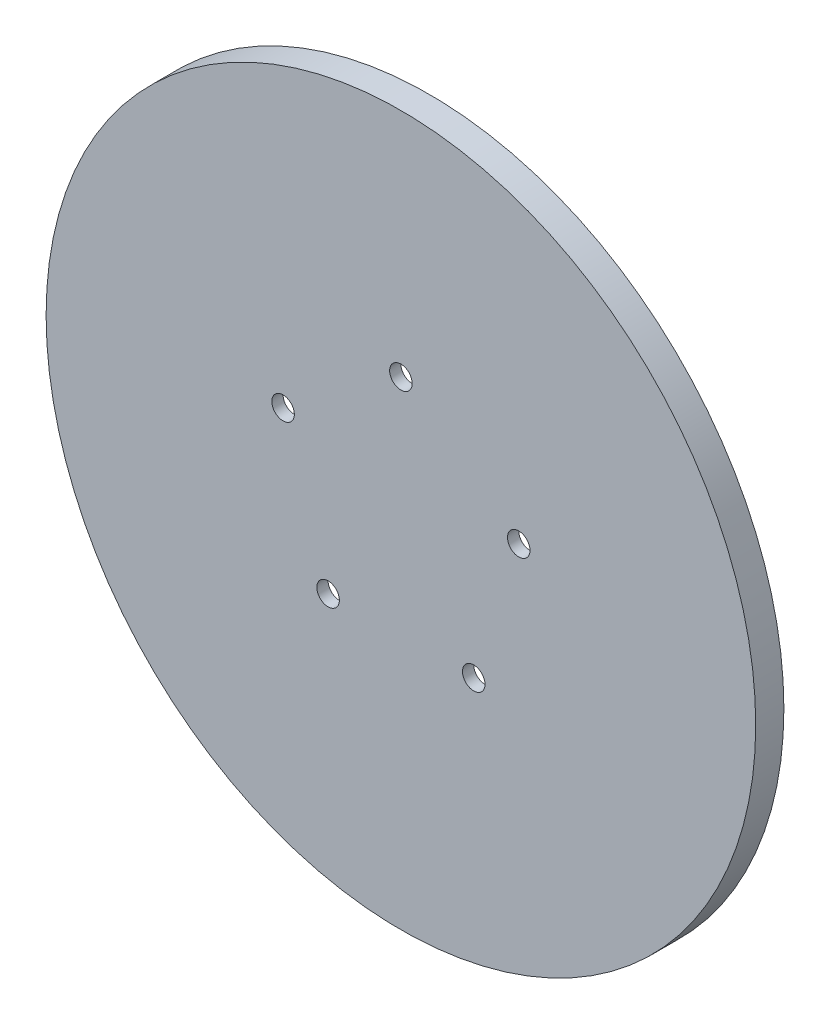
ISO-10303-21;
HEADER;
FILE_DESCRIPTION(('STEP AP214'),'2;1');
FILE_NAME('part.step','',(''),(''),'','','');
FILE_SCHEMA(('AUTOMOTIVE_DESIGN { 1 0 10303 214 1 1 1 1 }'));
ENDSEC;
DATA;
#1=APPLICATION_CONTEXT('core data for automotive mechanical design processes');
#2=APPLICATION_PROTOCOL_DEFINITION('international standard','automotive_design',2000,#1);
#3=PRODUCT_CONTEXT('',#1,'mechanical');
#4=PRODUCT('Part','Part','',(#3));
#5=PRODUCT_RELATED_PRODUCT_CATEGORY('part','',(#4));
#6=PRODUCT_DEFINITION_FORMATION('','',#4);
#7=PRODUCT_DEFINITION_CONTEXT('part definition',#1,'design');
#8=PRODUCT_DEFINITION('design','',#6,#7);
#9=PRODUCT_DEFINITION_SHAPE('','',#8);
#10=(LENGTH_UNIT() NAMED_UNIT(*) SI_UNIT(.MILLI.,.METRE.));
#11=(NAMED_UNIT(*) PLANE_ANGLE_UNIT() SI_UNIT($,.RADIAN.));
#12=(NAMED_UNIT(*) SI_UNIT($,.STERADIAN.) SOLID_ANGLE_UNIT());
#13=UNCERTAINTY_MEASURE_WITH_UNIT(LENGTH_MEASURE(1.E-05),#10,'distance_accuracy_value','');
#14=(GEOMETRIC_REPRESENTATION_CONTEXT(3) GLOBAL_UNCERTAINTY_ASSIGNED_CONTEXT((#13)) GLOBAL_UNIT_ASSIGNED_CONTEXT((#10,
#11,#12)) REPRESENTATION_CONTEXT('',''));
#15=CARTESIAN_POINT('',(0.,0.,0.));
#16=DIRECTION('',(0.,0.,1.));
#17=DIRECTION('',(1.,0.,0.));
#18=AXIS2_PLACEMENT_3D('',#15,#16,#17);
#19=CARTESIAN_POINT('',(0.,0.,33.2994));
#20=DIRECTION('',(0.,0.,-1.));
#21=DIRECTION('',(-1.,0.,0.));
#22=AXIS2_PLACEMENT_3D('',#19,#20,#21);
#23=CYLINDRICAL_SURFACE('',#22,75.4214507689291);
#24=DIRECTION('',(0.,0.,1.));
#25=VECTOR('',#24,1.);
#26=CARTESIAN_POINT('',(-38.3699227686586,64.9318432113026,29.4894));
#27=LINE('',#26,#25);
#28=CARTESIAN_POINT('',(-38.3699227686586,64.9318432113025,29.4894));
#29=VERTEX_POINT('',#28);
#30=CARTESIAN_POINT('',(-38.3699227686586,64.9318432113025,33.2994));
#31=VERTEX_POINT('',#30);
#32=EDGE_CURVE('E161',#29,#31,#27,.T.);
#33=ORIENTED_EDGE('',*,*,#32,.F.);
#34=CARTESIAN_POINT('',(0.,0.,29.4894));
#35=DIRECTION('',(0.,0.,1.));
#36=DIRECTION('',(1.,0.,0.));
#37=AXIS2_PLACEMENT_3D('',#34,#35,#36);
#38=CIRCLE('',#37,75.4214507689291);
#39=CARTESIAN_POINT('',(60.2975269398968,45.3056672064591,29.4894));
#40=VERTEX_POINT('',#39);
#41=EDGE_CURVE('E319',#40,#29,#38,.T.);
#42=ORIENTED_EDGE('',*,*,#41,.F.);
#43=DIRECTION('',(0.,0.,1.));
#44=VECTOR('',#43,1.);
#45=CARTESIAN_POINT('',(60.2975269398968,45.3056672064591,29.4894));
#46=LINE('',#45,#44);
#47=CARTESIAN_POINT('',(60.2975269398968,45.3056672064591,33.2994));
#48=VERTEX_POINT('',#47);
#49=EDGE_CURVE('E177',#40,#48,#46,.T.);
#50=ORIENTED_EDGE('',*,*,#49,.T.);
#51=CARTESIAN_POINT('',(0.,0.,33.2994));
#52=DIRECTION('',(0.,0.,1.));
#53=DIRECTION('',(1.,0.,0.));
#54=AXIS2_PLACEMENT_3D('',#51,#52,#53);
#55=CIRCLE('',#54,75.4214507689291);
#56=EDGE_CURVE('E175',#48,#31,#55,.T.);
#57=ORIENTED_EDGE('',*,*,#56,.T.);
#58=EDGE_LOOP('',(#33,#42,#50,#57));
#59=FACE_BOUND('',#58,.T.);
#60=ADVANCED_FACE('F47',(#59),#23,.F.);
#61=DIRECTION('',(0.,0.,1.));
#62=VECTOR('',#61,1.);
#63=CARTESIAN_POINT('',(64.9318432113027,38.3699227686583,29.4894));
#64=LINE('',#63,#62);
#65=CARTESIAN_POINT('',(64.9318432113027,38.3699227686583,29.4894));
#66=VERTEX_POINT('',#65);
#67=CARTESIAN_POINT('',(64.9318432113027,38.3699227686583,33.2994));
#68=VERTEX_POINT('',#67);
#69=EDGE_CURVE('E218',#66,#68,#64,.T.);
#70=ORIENTED_EDGE('',*,*,#69,.F.);
#71=CARTESIAN_POINT('',(45.3056672064589,-60.2975269398969,29.4894));
#72=VERTEX_POINT('',#71);
#73=EDGE_CURVE('E63',#72,#66,#38,.T.);
#74=ORIENTED_EDGE('',*,*,#73,.F.);
#75=DIRECTION('',(0.,0.,1.));
#76=VECTOR('',#75,1.);
#77=CARTESIAN_POINT('',(45.3056672064589,-60.297526939897,29.4894));
#78=LINE('',#77,#76);
#79=CARTESIAN_POINT('',(45.3056672064589,-60.297526939897,33.2994));
#80=VERTEX_POINT('',#79);
#81=EDGE_CURVE('E245',#72,#80,#78,.T.);
#82=ORIENTED_EDGE('',*,*,#81,.T.);
#83=EDGE_CURVE('E184',#80,#68,#55,.T.);
#84=ORIENTED_EDGE('',*,*,#83,.T.);
#85=EDGE_LOOP('',(#70,#74,#82,#84));
#86=FACE_BOUND('',#85,.T.);
#87=ADVANCED_FACE('F347',(#86),#23,.F.);
#88=DIRECTION('',(0.,0.,1.));
#89=VECTOR('',#88,1.);
#90=CARTESIAN_POINT('',(38.3699227686581,-64.9318432113028,29.4894));
#91=LINE('',#90,#89);
#92=CARTESIAN_POINT('',(38.3699227686581,-64.9318432113028,29.4894));
#93=VERTEX_POINT('',#92);
#94=CARTESIAN_POINT('',(38.3699227686581,-64.9318432113028,33.2994));
#95=VERTEX_POINT('',#94);
#96=EDGE_CURVE('E71',#93,#95,#91,.T.);
#97=ORIENTED_EDGE('',*,*,#96,.F.);
#98=CARTESIAN_POINT('',(-60.2975269398967,-45.3056672064592,29.4894));
#99=VERTEX_POINT('',#98);
#100=EDGE_CURVE('E321',#99,#93,#38,.T.);
#101=ORIENTED_EDGE('',*,*,#100,.F.);
#102=DIRECTION('',(0.,0.,1.));
#103=VECTOR('',#102,1.);
#104=CARTESIAN_POINT('',(-60.2975269398969,-45.3056672064593,29.4894));
#105=LINE('',#104,#103);
#106=CARTESIAN_POINT('',(-60.2975269398969,-45.3056672064593,33.2994));
#107=VERTEX_POINT('',#106);
#108=EDGE_CURVE('E280',#99,#107,#105,.T.);
#109=ORIENTED_EDGE('',*,*,#108,.T.);
#110=EDGE_CURVE('E318',#107,#95,#55,.T.);
#111=ORIENTED_EDGE('',*,*,#110,.T.);
#112=EDGE_LOOP('',(#97,#101,#109,#111));
#113=FACE_BOUND('',#112,.T.);
#114=ADVANCED_FACE('F331',(#113),#23,.F.);
#115=CARTESIAN_POINT('',(0.,0.,29.4894));
#116=DIRECTION('',(0.,0.,1.));
#117=DIRECTION('',(1.,0.,0.));
#118=AXIS2_PLACEMENT_3D('',#115,#116,#117);
#119=PLANE('',#118);
#120=CARTESIAN_POINT('',(0.,0.,29.4894));
#121=DIRECTION('',(0.,0.,1.));
#122=DIRECTION('',(1.,0.,0.));
#123=AXIS2_PLACEMENT_3D('',#120,#121,#122);
#124=CIRCLE('',#123,80.01);
#125=CARTESIAN_POINT('',(-80.01,0.,29.4894));
#126=VERTEX_POINT('',#125);
#127=EDGE_CURVE('E56',#126,#126,#124,.T.);
#128=ORIENTED_EDGE('',*,*,#127,.F.);
#129=EDGE_LOOP('',(#128));
#130=FACE_BOUND('',#129,.T.);
#131=ORIENTED_EDGE('',*,*,#73,.T.);
#132=DIRECTION('',(0.982729786021431,0.185046393280905,0.));
#133=VECTOR('',#132,1.);
#134=CARTESIAN_POINT('',(62.8753809956867,37.9826943348293,29.4894));
#135=LINE('',#134,#133);
#136=CARTESIAN_POINT('',(62.8753809956867,37.9826943348293,29.4894));
#137=VERTEX_POINT('',#136);
#138=EDGE_CURVE('E211',#137,#66,#135,.T.);
#139=ORIENTED_EDGE('',*,*,#138,.F.);
#140=CARTESIAN_POINT('',(61.197126656589,40.8906127339731,29.4894));
#141=DIRECTION('',(0.,0.,1.));
#142=DIRECTION('',(1.,0.,0.));
#143=AXIS2_PLACEMENT_3D('',#140,#141,#142);
#144=CIRCLE('',#143,3.35745842011173);
#145=CARTESIAN_POINT('',(59.1528004962747,43.5539297622357,29.4894));
#146=VERTEX_POINT('',#145);
#147=EDGE_CURVE('E238',#146,#137,#144,.T.);
#148=ORIENTED_EDGE('',*,*,#147,.F.);
#149=DIRECTION('',(-0.547034982919377,-0.837109746366865,0.));
#150=VECTOR('',#149,1.);
#151=CARTESIAN_POINT('',(60.2975269398968,45.3056672064591,29.4894));
#152=LINE('',#151,#150);
#153=EDGE_CURVE('E228',#40,#146,#152,.T.);
#154=ORIENTED_EDGE('',*,*,#153,.F.);
#155=ORIENTED_EDGE('',*,*,#41,.T.);
#156=DIRECTION('',(-0.185046393280908,0.982729786021431,0.));
#157=VECTOR('',#156,1.);
#158=CARTESIAN_POINT('',(-37.9826943348296,62.8753809956866,29.4894));
#159=LINE('',#158,#157);
#160=CARTESIAN_POINT('',(-37.9826943348296,62.8753809956866,29.4894));
#161=VERTEX_POINT('',#160);
#162=EDGE_CURVE('E168',#161,#29,#159,.T.);
#163=ORIENTED_EDGE('',*,*,#162,.F.);
#164=CARTESIAN_POINT('',(-40.8906127339733,61.1971266565889,29.4894));
#165=DIRECTION('',(0.,0.,1.));
#166=DIRECTION('',(1.,0.,0.));
#167=AXIS2_PLACEMENT_3D('',#164,#165,#166);
#168=CIRCLE('',#167,3.35745842011173);
#169=CARTESIAN_POINT('',(-43.5539297622359,59.1528004962745,29.4894));
#170=VERTEX_POINT('',#169);
#171=EDGE_CURVE('E195',#170,#161,#168,.T.);
#172=ORIENTED_EDGE('',*,*,#171,.F.);
#173=DIRECTION('',(0.837109746366866,-0.547034982919375,0.));
#174=VECTOR('',#173,1.);
#175=CARTESIAN_POINT('',(-45.3056672064593,60.2975269398966,29.4894));
#176=LINE('',#175,#174);
#177=CARTESIAN_POINT('',(-45.3056672064593,60.2975269398966,29.4894));
#178=VERTEX_POINT('',#177);
#179=EDGE_CURVE('E190',#178,#170,#176,.T.);
#180=ORIENTED_EDGE('',*,*,#179,.F.);
#181=CARTESIAN_POINT('',(-64.9318432113026,-38.3699227686585,29.4894));
#182=VERTEX_POINT('',#181);
#183=EDGE_CURVE('E362',#178,#182,#38,.T.);
#184=ORIENTED_EDGE('',*,*,#183,.T.);
#185=DIRECTION('',(-0.982729786021368,-0.185046393281242,0.));
#186=VECTOR('',#185,1.);
#187=CARTESIAN_POINT('',(-62.875380995687,-37.9826943348289,29.4894));
#188=LINE('',#187,#186);
#189=CARTESIAN_POINT('',(-62.875380995687,-37.9826943348289,29.4894));
#190=VERTEX_POINT('',#189);
#191=EDGE_CURVE('E283',#190,#182,#188,.T.);
#192=ORIENTED_EDGE('',*,*,#191,.F.);
#193=CARTESIAN_POINT('',(-61.1971266565893,-40.8906127339727,29.4894));
#194=DIRECTION('',(0.,0.,1.));
#195=DIRECTION('',(1.,0.,0.));
#196=AXIS2_PLACEMENT_3D('',#193,#194,#195);
#197=CIRCLE('',#196,3.35745842011173);
#198=CARTESIAN_POINT('',(-59.152800496275,-43.5539297622353,29.4894));
#199=VERTEX_POINT('',#198);
#200=EDGE_CURVE('E310',#199,#190,#197,.T.);
#201=ORIENTED_EDGE('',*,*,#200,.F.);
#202=DIRECTION('',(0.547034982919149,0.837109746367014,0.));
#203=VECTOR('',#202,1.);
#204=CARTESIAN_POINT('',(-60.2975269398969,-45.3056672064593,29.4894));
#205=LINE('',#204,#203);
#206=EDGE_CURVE('E300',#99,#199,#205,.T.);
#207=ORIENTED_EDGE('',*,*,#206,.F.);
#208=ORIENTED_EDGE('',*,*,#100,.T.);
#209=DIRECTION('',(0.185046393280902,-0.982729786021432,0.));
#210=VECTOR('',#209,1.);
#211=CARTESIAN_POINT('',(37.9826943348291,-62.8753809956868,29.4894));
#212=LINE('',#211,#210);
#213=CARTESIAN_POINT('',(37.9826943348291,-62.8753809956868,29.4894));
#214=VERTEX_POINT('',#213);
#215=EDGE_CURVE('E248',#214,#93,#212,.T.);
#216=ORIENTED_EDGE('',*,*,#215,.F.);
#217=CARTESIAN_POINT('',(40.8906127339729,-61.1971266565892,29.4894));
#218=DIRECTION('',(0.,0.,1.));
#219=DIRECTION('',(1.,0.,0.));
#220=AXIS2_PLACEMENT_3D('',#217,#218,#219);
#221=CIRCLE('',#220,3.35745842011173);
#222=CARTESIAN_POINT('',(43.5539297622355,-59.1528004962748,29.4894));
#223=VERTEX_POINT('',#222);
#224=EDGE_CURVE('E273',#223,#214,#221,.T.);
#225=ORIENTED_EDGE('',*,*,#224,.F.);
#226=DIRECTION('',(-0.837109746366862,0.547034982919381,0.));
#227=VECTOR('',#226,1.);
#228=CARTESIAN_POINT('',(45.3056672064589,-60.297526939897,29.4894));
#229=LINE('',#228,#227);
#230=EDGE_CURVE('E263',#72,#223,#229,.T.);
#231=ORIENTED_EDGE('',*,*,#230,.F.);
#232=EDGE_LOOP('',(#131,#139,#148,#154,#155,#163,#172,#180,#184,#192,#201,#207,#208,#216,#225,#231));
#233=FACE_BOUND('',#232,.T.);
#234=ADVANCED_FACE('F328',(#130,#233),#119,.F.);
#235=CARTESIAN_POINT('',(0.,0.,33.2994));
#236=DIRECTION('',(0.,0.,-1.));
#237=DIRECTION('',(-1.,0.,0.));
#238=AXIS2_PLACEMENT_3D('',#235,#236,#237);
#239=CYLINDRICAL_SURFACE('',#238,80.01);
#240=CARTESIAN_POINT('',(0.,0.,35.8394));
#241=DIRECTION('',(0.,0.,1.));
#242=DIRECTION('',(1.,0.,0.));
#243=AXIS2_PLACEMENT_3D('',#240,#241,#242);
#244=CIRCLE('',#243,80.01);
#245=CARTESIAN_POINT('',(-80.01,0.,35.8394));
#246=VERTEX_POINT('',#245);
#247=EDGE_CURVE('E294',#246,#246,#244,.T.);
#248=CARTESIAN_POINT('',(-80.01,0.,29.4894));
#249=CARTESIAN_POINT('',(-80.01,0.,29.5555458333333));
#250=CARTESIAN_POINT('',(-80.01,0.,29.6216916666667));
#251=CARTESIAN_POINT('',(-80.01,0.,29.7539833333333));
#252=CARTESIAN_POINT('',(-80.01,0.,29.8201291666667));
#253=CARTESIAN_POINT('',(-80.01,0.,29.9524208333333));
#254=CARTESIAN_POINT('',(-80.01,0.,30.0185666666667));
#255=CARTESIAN_POINT('',(-80.01,0.,30.1508583333333));
#256=CARTESIAN_POINT('',(-80.01,0.,30.2170041666667));
#257=CARTESIAN_POINT('',(-80.01,0.,30.3492958333333));
#258=CARTESIAN_POINT('',(-80.01,0.,30.4154416666667));
#259=CARTESIAN_POINT('',(-80.01,0.,30.5477333333333));
#260=CARTESIAN_POINT('',(-80.01,0.,30.6138791666667));
#261=CARTESIAN_POINT('',(-80.01,0.,30.7461708333333));
#262=CARTESIAN_POINT('',(-80.01,0.,30.8123166666667));
#263=CARTESIAN_POINT('',(-80.01,0.,30.9446083333333));
#264=CARTESIAN_POINT('',(-80.01,0.,31.0107541666667));
#265=CARTESIAN_POINT('',(-80.01,0.,31.1430458333333));
#266=CARTESIAN_POINT('',(-80.01,0.,31.2091916666667));
#267=CARTESIAN_POINT('',(-80.01,0.,31.3414833333333));
#268=CARTESIAN_POINT('',(-80.01,0.,31.4076291666667));
#269=CARTESIAN_POINT('',(-80.01,0.,31.5399208333333));
#270=CARTESIAN_POINT('',(-80.01,0.,31.6060666666667));
#271=CARTESIAN_POINT('',(-80.01,0.,31.7383583333333));
#272=CARTESIAN_POINT('',(-80.01,0.,31.8045041666667));
#273=CARTESIAN_POINT('',(-80.01,0.,31.9367958333333));
#274=CARTESIAN_POINT('',(-80.01,0.,32.0029416666667));
#275=CARTESIAN_POINT('',(-80.01,0.,32.1352333333333));
#276=CARTESIAN_POINT('',(-80.01,0.,32.2013791666667));
#277=CARTESIAN_POINT('',(-80.01,0.,32.3336708333333));
#278=CARTESIAN_POINT('',(-80.01,0.,32.3998166666667));
#279=CARTESIAN_POINT('',(-80.01,0.,32.5321083333333));
#280=CARTESIAN_POINT('',(-80.01,0.,32.5982541666667));
#281=CARTESIAN_POINT('',(-80.01,0.,32.7305458333333));
#282=CARTESIAN_POINT('',(-80.01,0.,32.7966916666667));
#283=CARTESIAN_POINT('',(-80.01,0.,32.9289833333333));
#284=CARTESIAN_POINT('',(-80.01,0.,32.9951291666667));
#285=CARTESIAN_POINT('',(-80.01,0.,33.1274208333333));
#286=CARTESIAN_POINT('',(-80.01,0.,33.1935666666667));
#287=CARTESIAN_POINT('',(-80.01,0.,33.3258583333333));
#288=CARTESIAN_POINT('',(-80.01,0.,33.3920041666667));
#289=CARTESIAN_POINT('',(-80.01,0.,33.5242958333333));
#290=CARTESIAN_POINT('',(-80.01,0.,33.5904416666667));
#291=CARTESIAN_POINT('',(-80.01,0.,33.7227333333333));
#292=CARTESIAN_POINT('',(-80.01,0.,33.7888791666667));
#293=CARTESIAN_POINT('',(-80.01,0.,33.9211708333333));
#294=CARTESIAN_POINT('',(-80.01,0.,33.9873166666667));
#295=CARTESIAN_POINT('',(-80.01,0.,34.1196083333333));
#296=CARTESIAN_POINT('',(-80.01,0.,34.1857541666667));
#297=CARTESIAN_POINT('',(-80.01,0.,34.3180458333333));
#298=CARTESIAN_POINT('',(-80.01,0.,34.3841916666667));
#299=CARTESIAN_POINT('',(-80.01,0.,34.5164833333333));
#300=CARTESIAN_POINT('',(-80.01,0.,34.5826291666667));
#301=CARTESIAN_POINT('',(-80.01,0.,34.7149208333333));
#302=CARTESIAN_POINT('',(-80.01,0.,34.7810666666667));
#303=CARTESIAN_POINT('',(-80.01,0.,34.9133583333333));
#304=CARTESIAN_POINT('',(-80.01,0.,34.9795041666667));
#305=CARTESIAN_POINT('',(-80.01,0.,35.1117958333333));
#306=CARTESIAN_POINT('',(-80.01,0.,35.1779416666667));
#307=CARTESIAN_POINT('',(-80.01,0.,35.3102333333333));
#308=CARTESIAN_POINT('',(-80.01,0.,35.3763791666667));
#309=CARTESIAN_POINT('',(-80.01,0.,35.5086708333333));
#310=CARTESIAN_POINT('',(-80.01,0.,35.5748166666667));
#311=CARTESIAN_POINT('',(-80.01,0.,35.7071083333333));
#312=CARTESIAN_POINT('',(-80.01,0.,35.7732541666667));
#313=CARTESIAN_POINT('',(-80.01,0.,35.8394));
#314=B_SPLINE_CURVE_WITH_KNOTS('',3,(#248,#249,#250,#251,#252,#253,#254,#255,#256,#257,#258,
#259,#260,#261,#262,#263,#264,#265,#266,#267,#268,#269,#270,#271,#272,#273,#274,#275,#276,#277,
#278,#279,#280,#281,#282,#283,#284,#285,#286,#287,#288,#289,#290,#291,#292,#293,#294,#295,#296,
#297,#298,#299,#300,#301,#302,#303,#304,#305,#306,#307,#308,#309,#310,#311,#312,#313),
.UNSPECIFIED.,.F.,.F.,(4,2,2,2,2,2,2,2,2,2,2,2,2,2,2,2,2,2,2,2,2,2,2,2,2,2,2,2,2,2,2,2,4),(0.,
0.198437500000002,0.396875000000001,0.5953125,0.793750000000003,0.992187500000002,1.190625,
1.3890625,1.5875,1.7859375,1.984375,2.1828125,2.38125,2.5796875,2.778125,2.97656250000001,3.175,
3.3734375,3.571875,3.7703125,3.96875,4.1671875,4.365625,4.5640625,4.7625,4.9609375,5.159375,
5.3578125,5.55625,5.7546875,5.953125,6.1515625,6.35),.UNSPECIFIED.);
#315=EDGE_CURVE('BSEAM49',#126,#246,#314,.T.);
#316=ORIENTED_EDGE('',*,*,#127,.T.);
#317=ORIENTED_EDGE('',*,*,#247,.F.);
#318=ORIENTED_EDGE('',*,*,#315,.T.);
#319=ORIENTED_EDGE('',*,*,#315,.F.);
#320=EDGE_LOOP('',(#316,#318,#317,#319));
#321=FACE_BOUND('',#320,.T.);
#322=ADVANCED_FACE('F49',(#321),#239,.T.);
#323=DIRECTION('',(0.,0.,1.));
#324=VECTOR('',#323,1.);
#325=CARTESIAN_POINT('',(-45.3056672064593,60.2975269398966,29.4894));
#326=LINE('',#325,#324);
#327=CARTESIAN_POINT('',(-45.3056672064593,60.2975269398966,33.2994));
#328=VERTEX_POINT('',#327);
#329=EDGE_CURVE('E206',#178,#328,#326,.T.);
#330=ORIENTED_EDGE('',*,*,#329,.T.);
#331=CARTESIAN_POINT('',(-64.9318432113026,-38.3699227686585,33.2994));
#332=VERTEX_POINT('',#331);
#333=EDGE_CURVE('E182',#328,#332,#55,.T.);
#334=ORIENTED_EDGE('',*,*,#333,.T.);
#335=DIRECTION('',(0.,0.,1.));
#336=VECTOR('',#335,1.);
#337=CARTESIAN_POINT('',(-64.9318432113028,-38.3699227686586,29.4894));
#338=LINE('',#337,#336);
#339=EDGE_CURVE('E290',#182,#332,#338,.T.);
#340=ORIENTED_EDGE('',*,*,#339,.F.);
#341=ORIENTED_EDGE('',*,*,#183,.F.);
#342=EDGE_LOOP('',(#330,#334,#340,#341));
#343=FACE_BOUND('',#342,.T.);
#344=ADVANCED_FACE('F392',(#343),#23,.F.);
#345=CARTESIAN_POINT('',(-62.875380995687,-37.9826943348289,29.4894));
#346=DIRECTION('',(-0.185046393281242,0.982729786021368,0.));
#347=DIRECTION('',(-0.982729786021368,-0.185046393281242,0.));
#348=AXIS2_PLACEMENT_3D('',#345,#346,#347);
#349=PLANE('',#348);
#350=DIRECTION('',(-0.982729786021368,-0.185046393281242,0.));
#351=VECTOR('',#350,1.);
#352=CARTESIAN_POINT('',(-62.875380995687,-37.9826943348289,33.2994));
#353=LINE('',#352,#351);
#354=CARTESIAN_POINT('',(-62.875380995687,-37.9826943348289,33.2994));
#355=VERTEX_POINT('',#354);
#356=EDGE_CURVE('E295',#355,#332,#353,.T.);
#357=ORIENTED_EDGE('',*,*,#356,.F.);
#358=DIRECTION('',(0.,0.,1.));
#359=VECTOR('',#358,1.);
#360=CARTESIAN_POINT('',(-62.875380995687,-37.9826943348289,29.4894));
#361=LINE('',#360,#359);
#362=EDGE_CURVE('E287',#190,#355,#361,.T.);
#363=ORIENTED_EDGE('',*,*,#362,.F.);
#364=ORIENTED_EDGE('',*,*,#191,.T.);
#365=ORIENTED_EDGE('',*,*,#339,.T.);
#366=EDGE_LOOP('',(#357,#363,#364,#365));
#367=FACE_BOUND('',#366,.T.);
#368=ADVANCED_FACE('F398',(#367),#349,.T.);
#369=CARTESIAN_POINT('',(-61.1971266565893,-40.8906127339727,29.4894));
#370=DIRECTION('',(0.,0.,1.));
#371=DIRECTION('',(1.,0.,0.));
#372=AXIS2_PLACEMENT_3D('',#369,#370,#371);
#373=CYLINDRICAL_SURFACE('',#372,3.35745842011173);
#374=CARTESIAN_POINT('',(-61.1971266565893,-40.8906127339727,33.2994));
#375=DIRECTION('',(0.,0.,1.));
#376=DIRECTION('',(1.,0.,0.));
#377=AXIS2_PLACEMENT_3D('',#374,#375,#376);
#378=CIRCLE('',#377,3.35745842011173);
#379=CARTESIAN_POINT('',(-59.152800496275,-43.5539297622353,33.2994));
#380=VERTEX_POINT('',#379);
#381=EDGE_CURVE('E299',#380,#355,#378,.T.);
#382=ORIENTED_EDGE('',*,*,#381,.F.);
#383=DIRECTION('',(0.,0.,1.));
#384=VECTOR('',#383,1.);
#385=CARTESIAN_POINT('',(-59.152800496275,-43.5539297622353,29.4894));
#386=LINE('',#385,#384);
#387=EDGE_CURVE('E284',#199,#380,#386,.T.);
#388=ORIENTED_EDGE('',*,*,#387,.F.);
#389=ORIENTED_EDGE('',*,*,#200,.T.);
#390=ORIENTED_EDGE('',*,*,#362,.T.);
#391=EDGE_LOOP('',(#382,#388,#389,#390));
#392=FACE_BOUND('',#391,.T.);
#393=ADVANCED_FACE('F404',(#392),#373,.T.);
#394=CARTESIAN_POINT('',(-60.2975269398969,-45.3056672064593,29.4894));
#395=DIRECTION('',(0.837109746367014,-0.547034982919149,0.));
#396=DIRECTION('',(0.547034982919149,0.837109746367014,0.));
#397=AXIS2_PLACEMENT_3D('',#394,#395,#396);
#398=PLANE('',#397);
#399=DIRECTION('',(0.547034982919149,0.837109746367014,0.));
#400=VECTOR('',#399,1.);
#401=CARTESIAN_POINT('',(-60.2975269398969,-45.3056672064593,33.2994));
#402=LINE('',#401,#400);
#403=EDGE_CURVE('E257',#107,#380,#402,.T.);
#404=ORIENTED_EDGE('',*,*,#403,.F.);
#405=ORIENTED_EDGE('',*,*,#108,.F.);
#406=ORIENTED_EDGE('',*,*,#206,.T.);
#407=ORIENTED_EDGE('',*,*,#387,.T.);
#408=EDGE_LOOP('',(#404,#405,#406,#407));
#409=FACE_BOUND('',#408,.T.);
#410=ADVANCED_FACE('F643',(#409),#398,.T.);
#411=CARTESIAN_POINT('',(37.9826943348291,-62.8753809956868,29.4894));
#412=DIRECTION('',(-0.982729786021432,-0.185046393280902,0.));
#413=DIRECTION('',(0.185046393280902,-0.982729786021432,0.));
#414=AXIS2_PLACEMENT_3D('',#411,#412,#413);
#415=PLANE('',#414);
#416=DIRECTION('',(0.185046393280902,-0.982729786021432,0.));
#417=VECTOR('',#416,1.);
#418=CARTESIAN_POINT('',(37.9826943348291,-62.8753809956868,33.2994));
#419=LINE('',#418,#417);
#420=CARTESIAN_POINT('',(37.9826943348291,-62.8753809956868,33.2994));
#421=VERTEX_POINT('',#420);
#422=EDGE_CURVE('E258',#421,#95,#419,.T.);
#423=ORIENTED_EDGE('',*,*,#422,.F.);
#424=DIRECTION('',(0.,0.,1.));
#425=VECTOR('',#424,1.);
#426=CARTESIAN_POINT('',(37.9826943348291,-62.8753809956868,29.4894));
#427=LINE('',#426,#425);
#428=EDGE_CURVE('E252',#214,#421,#427,.T.);
#429=ORIENTED_EDGE('',*,*,#428,.F.);
#430=ORIENTED_EDGE('',*,*,#215,.T.);
#431=ORIENTED_EDGE('',*,*,#96,.T.);
#432=EDGE_LOOP('',(#423,#429,#430,#431));
#433=FACE_BOUND('',#432,.T.);
#434=ADVANCED_FACE('F356',(#433),#415,.T.);
#435=CARTESIAN_POINT('',(40.8906127339729,-61.1971266565892,29.4894));
#436=DIRECTION('',(0.,0.,1.));
#437=DIRECTION('',(1.,0.,0.));
#438=AXIS2_PLACEMENT_3D('',#435,#436,#437);
#439=CYLINDRICAL_SURFACE('',#438,3.35745842011173);
#440=CARTESIAN_POINT('',(40.8906127339729,-61.1971266565892,33.2994));
#441=DIRECTION('',(0.,0.,1.));
#442=DIRECTION('',(1.,0.,0.));
#443=AXIS2_PLACEMENT_3D('',#440,#441,#442);
#444=CIRCLE('',#443,3.35745842011173);
#445=CARTESIAN_POINT('',(43.5539297622355,-59.1528004962748,33.2994));
#446=VERTEX_POINT('',#445);
#447=EDGE_CURVE('E262',#446,#421,#444,.T.);
#448=ORIENTED_EDGE('',*,*,#447,.F.);
#449=DIRECTION('',(0.,0.,1.));
#450=VECTOR('',#449,1.);
#451=CARTESIAN_POINT('',(43.5539297622355,-59.1528004962748,29.4894));
#452=LINE('',#451,#450);
#453=EDGE_CURVE('E249',#223,#446,#452,.T.);
#454=ORIENTED_EDGE('',*,*,#453,.F.);
#455=ORIENTED_EDGE('',*,*,#224,.T.);
#456=ORIENTED_EDGE('',*,*,#428,.T.);
#457=EDGE_LOOP('',(#448,#454,#455,#456));
#458=FACE_BOUND('',#457,.T.);
#459=ADVANCED_FACE('F352',(#458),#439,.T.);
#460=CARTESIAN_POINT('',(45.3056672064589,-60.297526939897,29.4894));
#461=DIRECTION('',(0.547034982919381,0.837109746366862,0.));
#462=DIRECTION('',(-0.837109746366862,0.547034982919381,0.));
#463=AXIS2_PLACEMENT_3D('',#460,#461,#462);
#464=PLANE('',#463);
#465=DIRECTION('',(-0.837109746366862,0.547034982919381,0.));
#466=VECTOR('',#465,1.);
#467=CARTESIAN_POINT('',(45.3056672064589,-60.297526939897,33.2994));
#468=LINE('',#467,#466);
#469=EDGE_CURVE('E222',#80,#446,#468,.T.);
#470=ORIENTED_EDGE('',*,*,#469,.F.);
#471=ORIENTED_EDGE('',*,*,#81,.F.);
#472=ORIENTED_EDGE('',*,*,#230,.T.);
#473=ORIENTED_EDGE('',*,*,#453,.T.);
#474=EDGE_LOOP('',(#470,#471,#472,#473));
#475=FACE_BOUND('',#474,.T.);
#476=ADVANCED_FACE('F349',(#475),#464,.T.);
#477=CARTESIAN_POINT('',(62.8753809956867,37.9826943348293,29.4894));
#478=DIRECTION('',(0.185046393280905,-0.982729786021432,0.));
#479=DIRECTION('',(0.982729786021432,0.185046393280905,0.));
#480=AXIS2_PLACEMENT_3D('',#477,#478,#479);
#481=PLANE('',#480);
#482=DIRECTION('',(0.982729786021431,0.185046393280905,0.));
#483=VECTOR('',#482,1.);
#484=CARTESIAN_POINT('',(62.8753809956867,37.9826943348293,33.2994));
#485=LINE('',#484,#483);
#486=CARTESIAN_POINT('',(62.8753809956867,37.9826943348293,33.2994));
#487=VERTEX_POINT('',#486);
#488=EDGE_CURVE('E223',#487,#68,#485,.T.);
#489=ORIENTED_EDGE('',*,*,#488,.F.);
#490=DIRECTION('',(0.,0.,1.));
#491=VECTOR('',#490,1.);
#492=CARTESIAN_POINT('',(62.8753809956867,37.9826943348293,29.4894));
#493=LINE('',#492,#491);
#494=EDGE_CURVE('E215',#137,#487,#493,.T.);
#495=ORIENTED_EDGE('',*,*,#494,.F.);
#496=ORIENTED_EDGE('',*,*,#138,.T.);
#497=ORIENTED_EDGE('',*,*,#69,.T.);
#498=EDGE_LOOP('',(#489,#495,#496,#497));
#499=FACE_BOUND('',#498,.T.);
#500=ADVANCED_FACE('F338',(#499),#481,.T.);
#501=CARTESIAN_POINT('',(61.197126656589,40.8906127339731,29.4894));
#502=DIRECTION('',(0.,0.,1.));
#503=DIRECTION('',(1.,0.,0.));
#504=AXIS2_PLACEMENT_3D('',#501,#502,#503);
#505=CYLINDRICAL_SURFACE('',#504,3.35745842011173);
#506=CARTESIAN_POINT('',(61.197126656589,40.8906127339731,33.2994));
#507=DIRECTION('',(0.,0.,1.));
#508=DIRECTION('',(1.,0.,0.));
#509=AXIS2_PLACEMENT_3D('',#506,#507,#508);
#510=CIRCLE('',#509,3.35745842011173);
#511=CARTESIAN_POINT('',(59.1528004962747,43.5539297622357,33.2994));
#512=VERTEX_POINT('',#511);
#513=EDGE_CURVE('E227',#512,#487,#510,.T.);
#514=ORIENTED_EDGE('',*,*,#513,.F.);
#515=DIRECTION('',(0.,0.,1.));
#516=VECTOR('',#515,1.);
#517=CARTESIAN_POINT('',(59.1528004962747,43.5539297622357,29.4894));
#518=LINE('',#517,#516);
#519=EDGE_CURVE('E212',#146,#512,#518,.T.);
#520=ORIENTED_EDGE('',*,*,#519,.F.);
#521=ORIENTED_EDGE('',*,*,#147,.T.);
#522=ORIENTED_EDGE('',*,*,#494,.T.);
#523=EDGE_LOOP('',(#514,#520,#521,#522));
#524=FACE_BOUND('',#523,.T.);
#525=ADVANCED_FACE('F341',(#524),#505,.T.);
#526=CARTESIAN_POINT('',(60.2975269398968,45.3056672064591,29.4894));
#527=DIRECTION('',(-0.837109746366865,0.547034982919377,0.));
#528=DIRECTION('',(-0.547034982919377,-0.837109746366865,0.));
#529=AXIS2_PLACEMENT_3D('',#526,#527,#528);
#530=PLANE('',#529);
#531=DIRECTION('',(-0.547034982919377,-0.837109746366865,0.));
#532=VECTOR('',#531,1.);
#533=CARTESIAN_POINT('',(60.2975269398968,45.3056672064591,33.2994));
#534=LINE('',#533,#532);
#535=EDGE_CURVE('E232',#48,#512,#534,.T.);
#536=ORIENTED_EDGE('',*,*,#535,.F.);
#537=ORIENTED_EDGE('',*,*,#49,.F.);
#538=ORIENTED_EDGE('',*,*,#153,.T.);
#539=ORIENTED_EDGE('',*,*,#519,.T.);
#540=EDGE_LOOP('',(#536,#537,#538,#539));
#541=FACE_BOUND('',#540,.T.);
#542=ADVANCED_FACE('F344',(#541),#530,.T.);
#543=CARTESIAN_POINT('',(-37.9826943348296,62.8753809956866,29.4894));
#544=DIRECTION('',(0.982729786021431,0.185046393280908,0.));
#545=DIRECTION('',(-0.185046393280908,0.982729786021431,0.));
#546=AXIS2_PLACEMENT_3D('',#543,#544,#545);
#547=PLANE('',#546);
#548=DIRECTION('',(-0.185046393280908,0.982729786021431,0.));
#549=VECTOR('',#548,1.);
#550=CARTESIAN_POINT('',(-37.9826943348296,62.8753809956866,33.2994));
#551=LINE('',#550,#549);
#552=CARTESIAN_POINT('',(-37.9826943348296,62.8753809956866,33.2994));
#553=VERTEX_POINT('',#552);
#554=EDGE_CURVE('E165',#553,#31,#551,.T.);
#555=ORIENTED_EDGE('',*,*,#554,.F.);
#556=DIRECTION('',(0.,0.,1.));
#557=VECTOR('',#556,1.);
#558=CARTESIAN_POINT('',(-37.9826943348296,62.8753809956866,29.4894));
#559=LINE('',#558,#557);
#560=EDGE_CURVE('E172',#161,#553,#559,.T.);
#561=ORIENTED_EDGE('',*,*,#560,.F.);
#562=ORIENTED_EDGE('',*,*,#162,.T.);
#563=ORIENTED_EDGE('',*,*,#32,.T.);
#564=EDGE_LOOP('',(#555,#561,#562,#563));
#565=FACE_BOUND('',#564,.T.);
#566=ADVANCED_FACE('F163',(#565),#547,.T.);
#567=CARTESIAN_POINT('',(-40.8906127339733,61.1971266565889,29.4894));
#568=DIRECTION('',(0.,0.,1.));
#569=DIRECTION('',(1.,0.,0.));
#570=AXIS2_PLACEMENT_3D('',#567,#568,#569);
#571=CYLINDRICAL_SURFACE('',#570,3.35745842011173);
#572=CARTESIAN_POINT('',(-40.8906127339733,61.1971266565889,33.2994));
#573=DIRECTION('',(0.,0.,1.));
#574=DIRECTION('',(1.,0.,0.));
#575=AXIS2_PLACEMENT_3D('',#572,#573,#574);
#576=CIRCLE('',#575,3.35745842011173);
#577=CARTESIAN_POINT('',(-43.5539297622359,59.1528004962745,33.2994));
#578=VERTEX_POINT('',#577);
#579=EDGE_CURVE('E188',#578,#553,#576,.T.);
#580=ORIENTED_EDGE('',*,*,#579,.F.);
#581=DIRECTION('',(0.,0.,1.));
#582=VECTOR('',#581,1.);
#583=CARTESIAN_POINT('',(-43.5539297622359,59.1528004962745,29.4894));
#584=LINE('',#583,#582);
#585=EDGE_CURVE('E203',#170,#578,#584,.T.);
#586=ORIENTED_EDGE('',*,*,#585,.F.);
#587=ORIENTED_EDGE('',*,*,#171,.T.);
#588=ORIENTED_EDGE('',*,*,#560,.T.);
#589=EDGE_LOOP('',(#580,#586,#587,#588));
#590=FACE_BOUND('',#589,.T.);
#591=ADVANCED_FACE('F381',(#590),#571,.T.);
#592=CARTESIAN_POINT('',(-45.3056672064593,60.2975269398966,29.4894));
#593=DIRECTION('',(-0.547034982919375,-0.837109746366866,0.));
#594=DIRECTION('',(0.837109746366866,-0.547034982919375,0.));
#595=AXIS2_PLACEMENT_3D('',#592,#593,#594);
#596=PLANE('',#595);
#597=DIRECTION('',(0.837109746366866,-0.547034982919375,0.));
#598=VECTOR('',#597,1.);
#599=CARTESIAN_POINT('',(-45.3056672064593,60.2975269398966,33.2994));
#600=LINE('',#599,#598);
#601=EDGE_CURVE('E197',#328,#578,#600,.T.);
#602=ORIENTED_EDGE('',*,*,#601,.F.);
#603=ORIENTED_EDGE('',*,*,#329,.F.);
#604=ORIENTED_EDGE('',*,*,#179,.T.);
#605=ORIENTED_EDGE('',*,*,#585,.T.);
#606=EDGE_LOOP('',(#602,#603,#604,#605));
#607=FACE_BOUND('',#606,.T.);
#608=ADVANCED_FACE('F379',(#607),#596,.T.);
#609=CARTESIAN_POINT('',(0.,0.,33.2994));
#610=DIRECTION('',(0.,0.,1.));
#611=DIRECTION('',(1.,0.,0.));
#612=AXIS2_PLACEMENT_3D('',#609,#610,#611);
#613=PLANE('',#612);
#614=CARTESIAN_POINT('',(0.,27.94,33.2994));
#615=DIRECTION('',(0.,0.,1.));
#616=DIRECTION('',(1.,0.,0.));
#617=AXIS2_PLACEMENT_3D('',#614,#615,#616);
#618=CIRCLE('',#617,2.54);
#619=CARTESIAN_POINT('',(2.54,27.94,33.2994));
#620=VERTEX_POINT('',#619);
#621=EDGE_CURVE('E522',#620,#620,#618,.T.);
#622=ORIENTED_EDGE('',*,*,#621,.T.);
#623=EDGE_LOOP('',(#622));
#624=FACE_BOUND('',#623,.T.);
#625=CARTESIAN_POINT('',(-26.5725190652866,8.63393482283596,33.2994));
#626=DIRECTION('',(0.,0.,1.));
#627=DIRECTION('',(1.,0.,0.));
#628=AXIS2_PLACEMENT_3D('',#625,#626,#627);
#629=CIRCLE('',#628,2.54);
#630=CARTESIAN_POINT('',(-24.0325190652866,8.63393482283596,33.2994));
#631=VERTEX_POINT('',#630);
#632=EDGE_CURVE('E525',#631,#631,#629,.T.);
#633=ORIENTED_EDGE('',*,*,#632,.T.);
#634=EDGE_LOOP('',(#633));
#635=FACE_BOUND('',#634,.T.);
#636=CARTESIAN_POINT('',(-16.4227199490516,-22.6039348228361,33.2994));
#637=DIRECTION('',(0.,0.,1.));
#638=DIRECTION('',(1.,0.,0.));
#639=AXIS2_PLACEMENT_3D('',#636,#637,#638);
#640=CIRCLE('',#639,2.54);
#641=CARTESIAN_POINT('',(-13.8827199490516,-22.6039348228361,33.2994));
#642=VERTEX_POINT('',#641);
#643=EDGE_CURVE('E532',#642,#642,#640,.T.);
#644=ORIENTED_EDGE('',*,*,#643,.T.);
#645=EDGE_LOOP('',(#644));
#646=FACE_BOUND('',#645,.T.);
#647=CARTESIAN_POINT('',(16.4227199490519,-22.6039348228359,33.2994));
#648=DIRECTION('',(0.,0.,1.));
#649=DIRECTION('',(1.,0.,0.));
#650=AXIS2_PLACEMENT_3D('',#647,#648,#649);
#651=CIRCLE('',#650,2.54);
#652=CARTESIAN_POINT('',(18.9627199490519,-22.6039348228359,33.2994));
#653=VERTEX_POINT('',#652);
#654=EDGE_CURVE('E543',#653,#653,#651,.T.);
#655=ORIENTED_EDGE('',*,*,#654,.T.);
#656=EDGE_LOOP('',(#655));
#657=FACE_BOUND('',#656,.T.);
#658=CARTESIAN_POINT('',(26.5725190652865,8.63393482283633,33.2994));
#659=DIRECTION('',(0.,0.,1.));
#660=DIRECTION('',(1.,0.,0.));
#661=AXIS2_PLACEMENT_3D('',#658,#659,#660);
#662=CIRCLE('',#661,2.54);
#663=CARTESIAN_POINT('',(29.1125190652865,8.63393482283633,33.2994));
#664=VERTEX_POINT('',#663);
#665=EDGE_CURVE('E547',#664,#664,#662,.T.);
#666=ORIENTED_EDGE('',*,*,#665,.T.);
#667=EDGE_LOOP('',(#666));
#668=FACE_BOUND('',#667,.T.);
#669=CARTESIAN_POINT('',(0.,0.,33.2994));
#670=DIRECTION('',(0.,0.,1.));
#671=DIRECTION('',(1.,0.,0.));
#672=AXIS2_PLACEMENT_3D('',#669,#670,#671);
#673=CIRCLE('',#672,7.9375);
#674=CARTESIAN_POINT('',(7.9375,0.,33.2994));
#675=VERTEX_POINT('',#674);
#676=EDGE_CURVE('E11',#675,#675,#673,.F.);
#677=ORIENTED_EDGE('',*,*,#676,.F.);
#678=EDGE_LOOP('',(#677));
#679=FACE_BOUND('',#678,.T.);
#680=ORIENTED_EDGE('',*,*,#56,.F.);
#681=ORIENTED_EDGE('',*,*,#535,.T.);
#682=ORIENTED_EDGE('',*,*,#513,.T.);
#683=ORIENTED_EDGE('',*,*,#488,.T.);
#684=ORIENTED_EDGE('',*,*,#83,.F.);
#685=ORIENTED_EDGE('',*,*,#469,.T.);
#686=ORIENTED_EDGE('',*,*,#447,.T.);
#687=ORIENTED_EDGE('',*,*,#422,.T.);
#688=ORIENTED_EDGE('',*,*,#110,.F.);
#689=ORIENTED_EDGE('',*,*,#403,.T.);
#690=ORIENTED_EDGE('',*,*,#381,.T.);
#691=ORIENTED_EDGE('',*,*,#356,.T.);
#692=ORIENTED_EDGE('',*,*,#333,.F.);
#693=ORIENTED_EDGE('',*,*,#601,.T.);
#694=ORIENTED_EDGE('',*,*,#579,.T.);
#695=ORIENTED_EDGE('',*,*,#554,.T.);
#696=EDGE_LOOP('',(#680,#681,#682,#683,#684,#685,#686,#687,#688,#689,#690,#691,#692,#693,#694,#695));
#697=FACE_BOUND('',#696,.T.);
#698=ADVANCED_FACE('F185',(#624,#635,#646,#657,#668,#679,#697),#613,.F.);
#699=CARTESIAN_POINT('',(0.,0.,35.8394));
#700=DIRECTION('',(0.,0.,1.));
#701=DIRECTION('',(1.,0.,0.));
#702=AXIS2_PLACEMENT_3D('',#699,#700,#701);
#703=PLANE('',#702);
#704=CARTESIAN_POINT('',(0.,27.94,35.8394));
#705=DIRECTION('',(0.,0.,-1.));
#706=DIRECTION('',(-1.,0.,0.));
#707=AXIS2_PLACEMENT_3D('',#704,#705,#706);
#708=CIRCLE('',#707,2.54);
#709=CARTESIAN_POINT('',(-2.54,27.94,35.8394));
#710=VERTEX_POINT('',#709);
#711=EDGE_CURVE('E519',#710,#710,#708,.T.);
#712=ORIENTED_EDGE('',*,*,#711,.T.);
#713=EDGE_LOOP('',(#712));
#714=FACE_BOUND('',#713,.T.);
#715=CARTESIAN_POINT('',(-26.5725190652866,8.63393482283596,35.8394));
#716=DIRECTION('',(0.,0.,-1.));
#717=DIRECTION('',(-1.,0.,0.));
#718=AXIS2_PLACEMENT_3D('',#715,#716,#717);
#719=CIRCLE('',#718,2.54);
#720=CARTESIAN_POINT('',(-29.1125190652866,8.63393482283596,35.8394));
#721=VERTEX_POINT('',#720);
#722=EDGE_CURVE('E563',#721,#721,#719,.T.);
#723=ORIENTED_EDGE('',*,*,#722,.T.);
#724=EDGE_LOOP('',(#723));
#725=FACE_BOUND('',#724,.T.);
#726=CARTESIAN_POINT('',(-16.4227199490516,-22.6039348228361,35.8394));
#727=DIRECTION('',(0.,0.,-1.));
#728=DIRECTION('',(-1.,0.,0.));
#729=AXIS2_PLACEMENT_3D('',#726,#727,#728);
#730=CIRCLE('',#729,2.54);
#731=CARTESIAN_POINT('',(-18.9627199490516,-22.6039348228361,35.8394));
#732=VERTEX_POINT('',#731);
#733=EDGE_CURVE('E559',#732,#732,#730,.T.);
#734=ORIENTED_EDGE('',*,*,#733,.T.);
#735=EDGE_LOOP('',(#734));
#736=FACE_BOUND('',#735,.T.);
#737=CARTESIAN_POINT('',(16.4227199490519,-22.6039348228359,35.8394));
#738=DIRECTION('',(0.,0.,-1.));
#739=DIRECTION('',(-1.,0.,0.));
#740=AXIS2_PLACEMENT_3D('',#737,#738,#739);
#741=CIRCLE('',#740,2.54);
#742=CARTESIAN_POINT('',(13.8827199490519,-22.6039348228359,35.8394));
#743=VERTEX_POINT('',#742);
#744=EDGE_CURVE('E555',#743,#743,#741,.T.);
#745=ORIENTED_EDGE('',*,*,#744,.T.);
#746=EDGE_LOOP('',(#745));
#747=FACE_BOUND('',#746,.T.);
#748=CARTESIAN_POINT('',(26.5725190652865,8.63393482283633,35.8394));
#749=DIRECTION('',(0.,0.,-1.));
#750=DIRECTION('',(-1.,0.,0.));
#751=AXIS2_PLACEMENT_3D('',#748,#749,#750);
#752=CIRCLE('',#751,2.54);
#753=CARTESIAN_POINT('',(24.0325190652865,8.63393482283633,35.8394));
#754=VERTEX_POINT('',#753);
#755=EDGE_CURVE('E551',#754,#754,#752,.T.);
#756=ORIENTED_EDGE('',*,*,#755,.T.);
#757=EDGE_LOOP('',(#756));
#758=FACE_BOUND('',#757,.T.);
#759=ORIENTED_EDGE('',*,*,#247,.T.);
#760=EDGE_LOOP('',(#759));
#761=FACE_BOUND('',#760,.T.);
#762=ADVANCED_FACE('F433',(#714,#725,#736,#747,#758,#761),#703,.T.);
#763=CARTESIAN_POINT('',(0.,0.,29.4894));
#764=DIRECTION('',(0.,0.,1.));
#765=DIRECTION('',(1.,0.,0.));
#766=AXIS2_PLACEMENT_3D('',#763,#764,#765);
#767=CYLINDRICAL_SURFACE('',#766,7.9375);
#768=CARTESIAN_POINT('',(0.,0.,29.4894));
#769=DIRECTION('',(0.,0.,-1.));
#770=DIRECTION('',(-1.,0.,0.));
#771=AXIS2_PLACEMENT_3D('',#768,#769,#770);
#772=CIRCLE('',#771,7.9375);
#773=CARTESIAN_POINT('',(7.9375,0.,29.4894));
#774=VERTEX_POINT('',#773);
#775=EDGE_CURVE('E524',#774,#774,#772,.T.);
#776=CARTESIAN_POINT('',(7.9375,0.,29.4894));
#777=CARTESIAN_POINT('',(7.9375,0.,29.5290875));
#778=CARTESIAN_POINT('',(7.9375,0.,29.568775));
#779=CARTESIAN_POINT('',(7.9375,0.,29.64815));
#780=CARTESIAN_POINT('',(7.9375,0.,29.6878375));
#781=CARTESIAN_POINT('',(7.9375,0.,29.7672125));
#782=CARTESIAN_POINT('',(7.9375,0.,29.8069));
#783=CARTESIAN_POINT('',(7.9375,0.,29.886275));
#784=CARTESIAN_POINT('',(7.9375,0.,29.9259625));
#785=CARTESIAN_POINT('',(7.9375,0.,30.0053375));
#786=CARTESIAN_POINT('',(7.9375,0.,30.045025));
#787=CARTESIAN_POINT('',(7.9375,0.,30.1244));
#788=CARTESIAN_POINT('',(7.9375,0.,30.1640875));
#789=CARTESIAN_POINT('',(7.9375,0.,30.2434625));
#790=CARTESIAN_POINT('',(7.9375,0.,30.28315));
#791=CARTESIAN_POINT('',(7.9375,0.,30.362525));
#792=CARTESIAN_POINT('',(7.9375,0.,30.4022125));
#793=CARTESIAN_POINT('',(7.9375,0.,30.4815875));
#794=CARTESIAN_POINT('',(7.9375,0.,30.521275));
#795=CARTESIAN_POINT('',(7.9375,0.,30.60065));
#796=CARTESIAN_POINT('',(7.9375,0.,30.6403375));
#797=CARTESIAN_POINT('',(7.9375,0.,30.7197125));
#798=CARTESIAN_POINT('',(7.9375,0.,30.7594));
#799=CARTESIAN_POINT('',(7.9375,0.,30.838775));
#800=CARTESIAN_POINT('',(7.9375,0.,30.8784625));
#801=CARTESIAN_POINT('',(7.9375,0.,30.9578375));
#802=CARTESIAN_POINT('',(7.9375,0.,30.997525));
#803=CARTESIAN_POINT('',(7.9375,0.,31.0769));
#804=CARTESIAN_POINT('',(7.9375,0.,31.1165875));
#805=CARTESIAN_POINT('',(7.9375,0.,31.1959625));
#806=CARTESIAN_POINT('',(7.9375,0.,31.23565));
#807=CARTESIAN_POINT('',(7.9375,0.,31.315025));
#808=CARTESIAN_POINT('',(7.9375,0.,31.3547125));
#809=CARTESIAN_POINT('',(7.9375,0.,31.4340875));
#810=CARTESIAN_POINT('',(7.9375,0.,31.473775));
#811=CARTESIAN_POINT('',(7.9375,0.,31.55315));
#812=CARTESIAN_POINT('',(7.9375,0.,31.5928375));
#813=CARTESIAN_POINT('',(7.9375,0.,31.6722125));
#814=CARTESIAN_POINT('',(7.9375,0.,31.7119));
#815=CARTESIAN_POINT('',(7.9375,0.,31.791275));
#816=CARTESIAN_POINT('',(7.9375,0.,31.8309625));
#817=CARTESIAN_POINT('',(7.9375,0.,31.9103375));
#818=CARTESIAN_POINT('',(7.9375,0.,31.950025));
#819=CARTESIAN_POINT('',(7.9375,0.,32.0294));
#820=CARTESIAN_POINT('',(7.9375,0.,32.0690875));
#821=CARTESIAN_POINT('',(7.9375,0.,32.1484625));
#822=CARTESIAN_POINT('',(7.9375,0.,32.18815));
#823=CARTESIAN_POINT('',(7.9375,0.,32.267525));
#824=CARTESIAN_POINT('',(7.9375,0.,32.3072125));
#825=CARTESIAN_POINT('',(7.9375,0.,32.3865875));
#826=CARTESIAN_POINT('',(7.9375,0.,32.426275));
#827=CARTESIAN_POINT('',(7.9375,0.,32.50565));
#828=CARTESIAN_POINT('',(7.9375,0.,32.5453375));
#829=CARTESIAN_POINT('',(7.9375,0.,32.6247125));
#830=CARTESIAN_POINT('',(7.9375,0.,32.6644));
#831=CARTESIAN_POINT('',(7.9375,0.,32.743775));
#832=CARTESIAN_POINT('',(7.9375,0.,32.7834625));
#833=CARTESIAN_POINT('',(7.9375,0.,32.8628375));
#834=CARTESIAN_POINT('',(7.9375,0.,32.902525));
#835=CARTESIAN_POINT('',(7.9375,0.,32.9819));
#836=CARTESIAN_POINT('',(7.9375,0.,33.0215875));
#837=CARTESIAN_POINT('',(7.9375,0.,33.1009625));
#838=CARTESIAN_POINT('',(7.9375,0.,33.14065));
#839=CARTESIAN_POINT('',(7.9375,0.,33.220025));
#840=CARTESIAN_POINT('',(7.9375,0.,33.2597125));
#841=CARTESIAN_POINT('',(7.9375,0.,33.2994));
#842=B_SPLINE_CURVE_WITH_KNOTS('',3,(#776,#777,#778,#779,#780,#781,#782,#783,#784,#785,#786,
#787,#788,#789,#790,#791,#792,#793,#794,#795,#796,#797,#798,#799,#800,#801,#802,#803,#804,#805,
#806,#807,#808,#809,#810,#811,#812,#813,#814,#815,#816,#817,#818,#819,#820,#821,#822,#823,#824,
#825,#826,#827,#828,#829,#830,#831,#832,#833,#834,#835,#836,#837,#838,#839,#840,#841),
.UNSPECIFIED.,.F.,.F.,(4,2,2,2,2,2,2,2,2,2,2,2,2,2,2,2,2,2,2,2,2,2,2,2,2,2,2,2,2,2,2,2,4),(0.,
0.119062499999999,0.238124999999999,0.357187499999998,0.476249999999998,0.595312499999997,
0.714374999999996,0.833437499999996,0.952499999999998,1.0715625,1.190625,1.3096875,1.42875,
1.5478125,1.66687499999999,1.7859375,1.90499999999999,2.0240625,2.14312499999999,2.2621875,
2.38125,2.50031249999999,2.619375,2.73843749999999,2.8575,2.9765625,3.09562499999999,3.2146875,
3.33374999999999,3.4528125,3.57187499999999,3.69093749999999,3.81),.UNSPECIFIED.);
#843=EDGE_CURVE('BSEAM444',#774,#675,#842,.T.);
#844=ORIENTED_EDGE('',*,*,#775,.F.);
#845=ORIENTED_EDGE('',*,*,#676,.T.);
#846=ORIENTED_EDGE('',*,*,#843,.T.);
#847=ORIENTED_EDGE('',*,*,#843,.F.);
#848=EDGE_LOOP('',(#844,#846,#845,#847));
#849=FACE_BOUND('',#848,.T.);
#850=ADVANCED_FACE('F444',(#849),#767,.T.);
#851=CARTESIAN_POINT('',(0.,0.,29.4894));
#852=DIRECTION('',(0.,0.,-1.));
#853=DIRECTION('',(-1.,0.,0.));
#854=AXIS2_PLACEMENT_3D('',#851,#852,#853);
#855=PLANE('',#854);
#856=ORIENTED_EDGE('',*,*,#775,.T.);
#857=EDGE_LOOP('',(#856));
#858=FACE_BOUND('',#857,.T.);
#859=ADVANCED_FACE('F455',(#858),#855,.T.);
#860=CARTESIAN_POINT('',(26.5725190652865,8.63393482283633,35.8394));
#861=DIRECTION('',(0.,0.,-1.));
#862=DIRECTION('',(-1.,0.,0.));
#863=AXIS2_PLACEMENT_3D('',#860,#861,#862);
#864=CYLINDRICAL_SURFACE('',#863,2.54);
#865=ORIENTED_EDGE('',*,*,#755,.F.);
#866=EDGE_LOOP('',(#865));
#867=FACE_BOUND('',#866,.T.);
#868=ORIENTED_EDGE('',*,*,#665,.F.);
#869=EDGE_LOOP('',(#868));
#870=FACE_BOUND('',#869,.T.);
#871=ADVANCED_FACE('F464',(#867,#870),#864,.F.);
#872=CARTESIAN_POINT('',(16.4227199490519,-22.6039348228359,35.8394));
#873=DIRECTION('',(0.,0.,-1.));
#874=DIRECTION('',(-1.,0.,0.));
#875=AXIS2_PLACEMENT_3D('',#872,#873,#874);
#876=CYLINDRICAL_SURFACE('',#875,2.54);
#877=ORIENTED_EDGE('',*,*,#744,.F.);
#878=EDGE_LOOP('',(#877));
#879=FACE_BOUND('',#878,.T.);
#880=ORIENTED_EDGE('',*,*,#654,.F.);
#881=EDGE_LOOP('',(#880));
#882=FACE_BOUND('',#881,.T.);
#883=ADVANCED_FACE('F473',(#879,#882),#876,.F.);
#884=CARTESIAN_POINT('',(-16.4227199490516,-22.6039348228361,35.8394));
#885=DIRECTION('',(0.,0.,-1.));
#886=DIRECTION('',(-1.,0.,0.));
#887=AXIS2_PLACEMENT_3D('',#884,#885,#886);
#888=CYLINDRICAL_SURFACE('',#887,2.54);
#889=ORIENTED_EDGE('',*,*,#733,.F.);
#890=EDGE_LOOP('',(#889));
#891=FACE_BOUND('',#890,.T.);
#892=ORIENTED_EDGE('',*,*,#643,.F.);
#893=EDGE_LOOP('',(#892));
#894=FACE_BOUND('',#893,.T.);
#895=ADVANCED_FACE('F483',(#891,#894),#888,.F.);
#896=CARTESIAN_POINT('',(-26.5725190652866,8.63393482283596,35.8394));
#897=DIRECTION('',(0.,0.,-1.));
#898=DIRECTION('',(-1.,0.,0.));
#899=AXIS2_PLACEMENT_3D('',#896,#897,#898);
#900=CYLINDRICAL_SURFACE('',#899,2.54);
#901=ORIENTED_EDGE('',*,*,#722,.F.);
#902=EDGE_LOOP('',(#901));
#903=FACE_BOUND('',#902,.T.);
#904=ORIENTED_EDGE('',*,*,#632,.F.);
#905=EDGE_LOOP('',(#904));
#906=FACE_BOUND('',#905,.T.);
#907=ADVANCED_FACE('F493',(#903,#906),#900,.F.);
#908=CARTESIAN_POINT('',(0.,27.94,35.8394));
#909=DIRECTION('',(0.,0.,-1.));
#910=DIRECTION('',(-1.,0.,0.));
#911=AXIS2_PLACEMENT_3D('',#908,#909,#910);
#912=CYLINDRICAL_SURFACE('',#911,2.54);
#913=ORIENTED_EDGE('',*,*,#711,.F.);
#914=EDGE_LOOP('',(#913));
#915=FACE_BOUND('',#914,.T.);
#916=ORIENTED_EDGE('',*,*,#621,.F.);
#917=EDGE_LOOP('',(#916));
#918=FACE_BOUND('',#917,.T.);
#919=ADVANCED_FACE('F503',(#915,#918),#912,.F.);
#920=CLOSED_SHELL('',(#60,#87,#114,#234,#322,#344,#368,#393,#410,#434,#459,#476,#500,#525,#542,
#566,#591,#608,#698,#762,#850,#859,#871,#883,#895,#907,#919));
#921=MANIFOLD_SOLID_BREP('B2',#920);
#922=ADVANCED_BREP_SHAPE_REPRESENTATION('',(#18,#921),#14);
#923=SHAPE_DEFINITION_REPRESENTATION(#9,#922);
ENDSEC;
END-ISO-10303-21;
